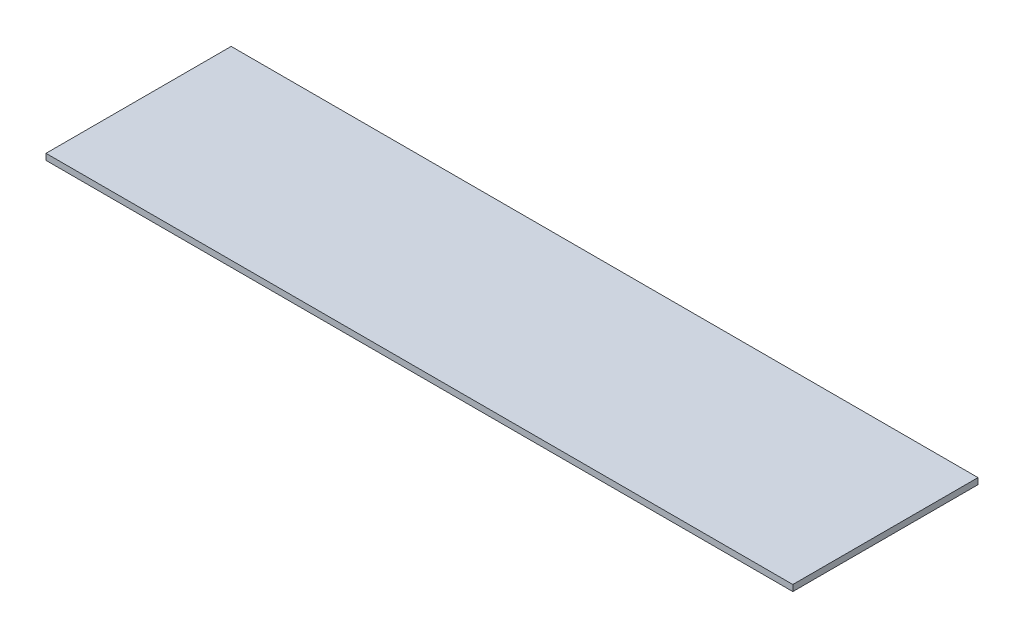
ISO-10303-21;
HEADER;
FILE_DESCRIPTION(('STEP AP214'),'2;1');
FILE_NAME('part.step','',(''),(''),'','','');
FILE_SCHEMA(('AUTOMOTIVE_DESIGN { 1 0 10303 214 1 1 1 1 }'));
ENDSEC;
DATA;
#1=APPLICATION_CONTEXT('core data for automotive mechanical design processes');
#2=APPLICATION_PROTOCOL_DEFINITION('international standard','automotive_design',2000,#1);
#3=PRODUCT_CONTEXT('',#1,'mechanical');
#4=PRODUCT('Part','Part','',(#3));
#5=PRODUCT_RELATED_PRODUCT_CATEGORY('part','',(#4));
#6=PRODUCT_DEFINITION_FORMATION('','',#4);
#7=PRODUCT_DEFINITION_CONTEXT('part definition',#1,'design');
#8=PRODUCT_DEFINITION('design','',#6,#7);
#9=PRODUCT_DEFINITION_SHAPE('','',#8);
#10=(LENGTH_UNIT() NAMED_UNIT(*) SI_UNIT(.MILLI.,.METRE.));
#11=(NAMED_UNIT(*) PLANE_ANGLE_UNIT() SI_UNIT($,.RADIAN.));
#12=(NAMED_UNIT(*) SI_UNIT($,.STERADIAN.) SOLID_ANGLE_UNIT());
#13=UNCERTAINTY_MEASURE_WITH_UNIT(LENGTH_MEASURE(1.E-05),#10,'distance_accuracy_value','');
#14=(GEOMETRIC_REPRESENTATION_CONTEXT(3) GLOBAL_UNCERTAINTY_ASSIGNED_CONTEXT((#13)) GLOBAL_UNIT_ASSIGNED_CONTEXT((#10,
#11,#12)) REPRESENTATION_CONTEXT('',''));
#15=CARTESIAN_POINT('',(0.,0.,0.));
#16=DIRECTION('',(0.,0.,1.));
#17=DIRECTION('',(1.,0.,0.));
#18=AXIS2_PLACEMENT_3D('',#15,#16,#17);
#19=CARTESIAN_POINT('',(605.,10.,150.));
#20=DIRECTION('',(-1.,0.,0.));
#21=DIRECTION('',(0.,0.,1.));
#22=AXIS2_PLACEMENT_3D('',#19,#20,#21);
#23=PLANE('',#22);
#24=DIRECTION('',(0.,0.,-1.));
#25=VECTOR('',#24,1.);
#26=CARTESIAN_POINT('',(605.,0.,150.));
#27=LINE('',#26,#25);
#28=CARTESIAN_POINT('',(605.,0.,150.));
#29=VERTEX_POINT('',#28);
#30=CARTESIAN_POINT('',(605.,0.,-150.));
#31=VERTEX_POINT('',#30);
#32=EDGE_CURVE('E96',#29,#31,#27,.T.);
#33=ORIENTED_EDGE('',*,*,#32,.T.);
#34=DIRECTION('',(0.,-1.,0.));
#35=VECTOR('',#34,1.);
#36=CARTESIAN_POINT('',(605.,10.,-150.));
#37=LINE('',#36,#35);
#38=CARTESIAN_POINT('',(605.,10.,-150.));
#39=VERTEX_POINT('',#38);
#40=EDGE_CURVE('E11',#39,#31,#37,.T.);
#41=ORIENTED_EDGE('',*,*,#40,.F.);
#42=DIRECTION('',(0.,0.,-1.));
#43=VECTOR('',#42,1.);
#44=CARTESIAN_POINT('',(605.,10.,150.));
#45=LINE('',#44,#43);
#46=CARTESIAN_POINT('',(605.,10.,150.));
#47=VERTEX_POINT('',#46);
#48=EDGE_CURVE('E84',#47,#39,#45,.T.);
#49=ORIENTED_EDGE('',*,*,#48,.F.);
#50=DIRECTION('',(0.,-1.,0.));
#51=VECTOR('',#50,1.);
#52=CARTESIAN_POINT('',(605.,10.,150.));
#53=LINE('',#52,#51);
#54=EDGE_CURVE('E92',#47,#29,#53,.T.);
#55=ORIENTED_EDGE('',*,*,#54,.T.);
#56=EDGE_LOOP('',(#33,#41,#49,#55));
#57=FACE_BOUND('',#56,.T.);
#58=ADVANCED_FACE('F33',(#57),#23,.F.);
#59=CARTESIAN_POINT('',(-605.,10.,-150.));
#60=DIRECTION('',(0.,0.,1.));
#61=DIRECTION('',(1.,0.,0.));
#62=AXIS2_PLACEMENT_3D('',#59,#60,#61);
#63=PLANE('',#62);
#64=DIRECTION('',(-1.,0.,0.));
#65=VECTOR('',#64,1.);
#66=CARTESIAN_POINT('',(-605.,0.,-150.));
#67=LINE('',#66,#65);
#68=CARTESIAN_POINT('',(-605.,0.,-150.));
#69=VERTEX_POINT('',#68);
#70=EDGE_CURVE('E88',#31,#69,#67,.T.);
#71=ORIENTED_EDGE('',*,*,#70,.T.);
#72=DIRECTION('',(0.,-1.,0.));
#73=VECTOR('',#72,1.);
#74=CARTESIAN_POINT('',(-605.,10.,-150.));
#75=LINE('',#74,#73);
#76=CARTESIAN_POINT('',(-605.,10.,-150.));
#77=VERTEX_POINT('',#76);
#78=EDGE_CURVE('E41',#77,#69,#75,.T.);
#79=ORIENTED_EDGE('',*,*,#78,.F.);
#80=DIRECTION('',(-1.,0.,0.));
#81=VECTOR('',#80,1.);
#82=CARTESIAN_POINT('',(-605.,10.,-150.));
#83=LINE('',#82,#81);
#84=EDGE_CURVE('E79',#39,#77,#83,.T.);
#85=ORIENTED_EDGE('',*,*,#84,.F.);
#86=ORIENTED_EDGE('',*,*,#40,.T.);
#87=EDGE_LOOP('',(#71,#79,#85,#86));
#88=FACE_BOUND('',#87,.T.);
#89=ADVANCED_FACE('F87',(#88),#63,.F.);
#90=CARTESIAN_POINT('',(-605.,10.,150.));
#91=DIRECTION('',(1.,0.,0.));
#92=DIRECTION('',(0.,0.,-1.));
#93=AXIS2_PLACEMENT_3D('',#90,#91,#92);
#94=PLANE('',#93);
#95=DIRECTION('',(0.,0.,1.));
#96=VECTOR('',#95,1.);
#97=CARTESIAN_POINT('',(-605.,0.,150.));
#98=LINE('',#97,#96);
#99=CARTESIAN_POINT('',(-605.,0.,150.));
#100=VERTEX_POINT('',#99);
#101=EDGE_CURVE('E66',#69,#100,#98,.T.);
#102=ORIENTED_EDGE('',*,*,#101,.T.);
#103=DIRECTION('',(0.,-1.,0.));
#104=VECTOR('',#103,1.);
#105=CARTESIAN_POINT('',(-605.,10.,150.));
#106=LINE('',#105,#104);
#107=CARTESIAN_POINT('',(-605.,10.,150.));
#108=VERTEX_POINT('',#107);
#109=EDGE_CURVE('E89',#108,#100,#106,.T.);
#110=ORIENTED_EDGE('',*,*,#109,.F.);
#111=DIRECTION('',(0.,0.,1.));
#112=VECTOR('',#111,1.);
#113=CARTESIAN_POINT('',(-605.,10.,150.));
#114=LINE('',#113,#112);
#115=EDGE_CURVE('E82',#77,#108,#114,.T.);
#116=ORIENTED_EDGE('',*,*,#115,.F.);
#117=ORIENTED_EDGE('',*,*,#78,.T.);
#118=EDGE_LOOP('',(#102,#110,#116,#117));
#119=FACE_BOUND('',#118,.T.);
#120=ADVANCED_FACE('F90',(#119),#94,.F.);
#121=CARTESIAN_POINT('',(-605.,10.,150.));
#122=DIRECTION('',(0.,0.,-1.));
#123=DIRECTION('',(-1.,0.,0.));
#124=AXIS2_PLACEMENT_3D('',#121,#122,#123);
#125=PLANE('',#124);
#126=DIRECTION('',(1.,0.,0.));
#127=VECTOR('',#126,1.);
#128=CARTESIAN_POINT('',(-605.,0.,150.));
#129=LINE('',#128,#127);
#130=EDGE_CURVE('E72',#100,#29,#129,.T.);
#131=ORIENTED_EDGE('',*,*,#130,.T.);
#132=ORIENTED_EDGE('',*,*,#54,.F.);
#133=DIRECTION('',(1.,0.,0.));
#134=VECTOR('',#133,1.);
#135=CARTESIAN_POINT('',(-605.,10.,150.));
#136=LINE('',#135,#134);
#137=EDGE_CURVE('E49',#108,#47,#136,.T.);
#138=ORIENTED_EDGE('',*,*,#137,.F.);
#139=ORIENTED_EDGE('',*,*,#109,.T.);
#140=EDGE_LOOP('',(#131,#132,#138,#139));
#141=FACE_BOUND('',#140,.T.);
#142=ADVANCED_FACE('F103',(#141),#125,.F.);
#143=CARTESIAN_POINT('',(0.,10.,0.));
#144=DIRECTION('',(0.,-1.,0.));
#145=DIRECTION('',(0.,0.,-1.));
#146=AXIS2_PLACEMENT_3D('',#143,#144,#145);
#147=PLANE('',#146);
#148=ORIENTED_EDGE('',*,*,#48,.T.);
#149=ORIENTED_EDGE('',*,*,#84,.T.);
#150=ORIENTED_EDGE('',*,*,#115,.T.);
#151=ORIENTED_EDGE('',*,*,#137,.T.);
#152=EDGE_LOOP('',(#148,#149,#150,#151));
#153=FACE_BOUND('',#152,.T.);
#154=ADVANCED_FACE('F80',(#153),#147,.F.);
#155=CARTESIAN_POINT('',(0.,0.,0.));
#156=DIRECTION('',(0.,-1.,0.));
#157=DIRECTION('',(0.,0.,-1.));
#158=AXIS2_PLACEMENT_3D('',#155,#156,#157);
#159=PLANE('',#158);
#160=ORIENTED_EDGE('',*,*,#32,.F.);
#161=ORIENTED_EDGE('',*,*,#130,.F.);
#162=ORIENTED_EDGE('',*,*,#101,.F.);
#163=ORIENTED_EDGE('',*,*,#70,.F.);
#164=EDGE_LOOP('',(#160,#161,#162,#163));
#165=FACE_BOUND('',#164,.T.);
#166=ADVANCED_FACE('F106',(#165),#159,.T.);
#167=CLOSED_SHELL('',(#58,#89,#120,#142,#154,#166));
#168=MANIFOLD_SOLID_BREP('B2',#167);
#169=ADVANCED_BREP_SHAPE_REPRESENTATION('',(#18,#168),#14);
#170=SHAPE_DEFINITION_REPRESENTATION(#9,#169);
ENDSEC;
END-ISO-10303-21;
